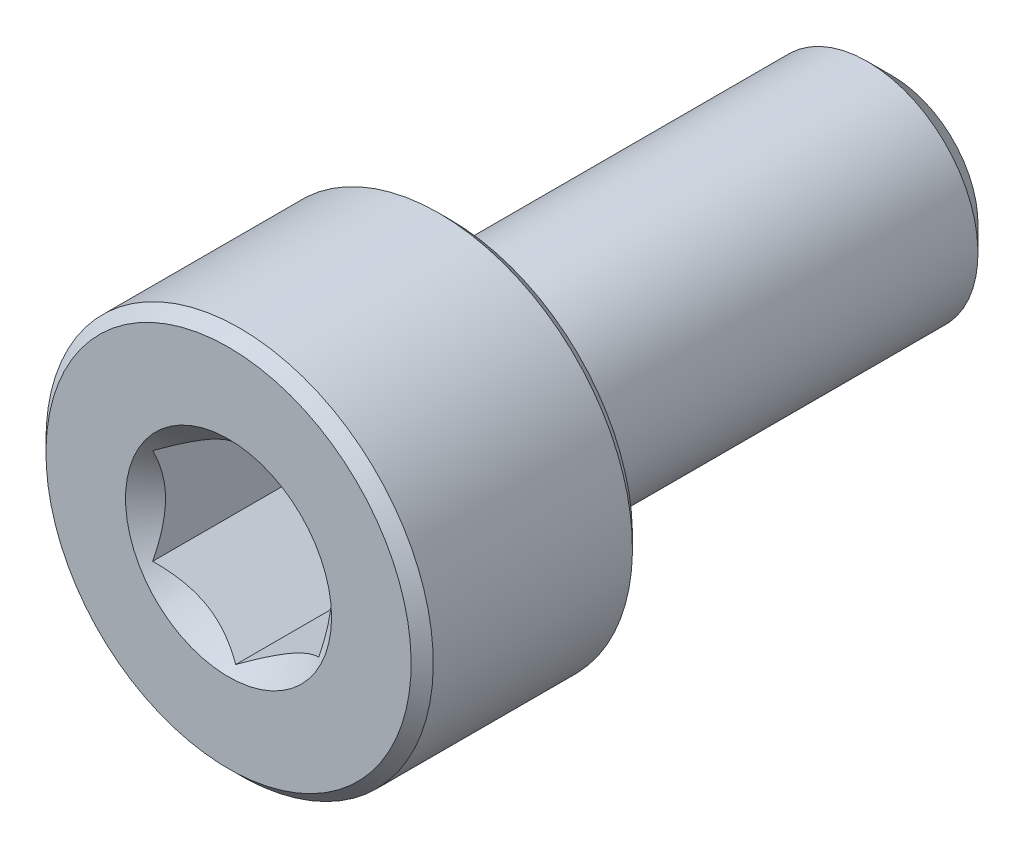
ISO-10303-21;
HEADER;
FILE_DESCRIPTION(('STEP AP214'),'2;1');
FILE_NAME('part.step','',(''),(''),'','','');
FILE_SCHEMA(('AUTOMOTIVE_DESIGN { 1 0 10303 214 1 1 1 1 }'));
ENDSEC;
DATA;
#1=APPLICATION_CONTEXT('core data for automotive mechanical design processes');
#2=APPLICATION_PROTOCOL_DEFINITION('international standard','automotive_design',2000,#1);
#3=PRODUCT_CONTEXT('',#1,'mechanical');
#4=PRODUCT('Part','Part','',(#3));
#5=PRODUCT_RELATED_PRODUCT_CATEGORY('part','',(#4));
#6=PRODUCT_DEFINITION_FORMATION('','',#4);
#7=PRODUCT_DEFINITION_CONTEXT('part definition',#1,'design');
#8=PRODUCT_DEFINITION('design','',#6,#7);
#9=PRODUCT_DEFINITION_SHAPE('','',#8);
#10=(LENGTH_UNIT() NAMED_UNIT(*) SI_UNIT(.MILLI.,.METRE.));
#11=(NAMED_UNIT(*) PLANE_ANGLE_UNIT() SI_UNIT($,.RADIAN.));
#12=(NAMED_UNIT(*) SI_UNIT($,.STERADIAN.) SOLID_ANGLE_UNIT());
#13=UNCERTAINTY_MEASURE_WITH_UNIT(LENGTH_MEASURE(1.E-05),#10,'distance_accuracy_value','');
#14=(GEOMETRIC_REPRESENTATION_CONTEXT(3) GLOBAL_UNCERTAINTY_ASSIGNED_CONTEXT((#13)) GLOBAL_UNIT_ASSIGNED_CONTEXT((#10,
#11,#12)) REPRESENTATION_CONTEXT('',''));
#15=CARTESIAN_POINT('',(0.,0.,0.));
#16=DIRECTION('',(0.,0.,1.));
#17=DIRECTION('',(1.,0.,0.));
#18=AXIS2_PLACEMENT_3D('',#15,#16,#17);
#19=CARTESIAN_POINT('',(0.,1.54533666301317,-6.));
#20=DIRECTION('',(0.,0.,-1.));
#21=DIRECTION('',(0.,1.,0.));
#22=AXIS2_PLACEMENT_3D('',#19,#20,#21);
#23=PLANE('',#22);
#24=CARTESIAN_POINT('',(0.,0.,-6.));
#25=DIRECTION('',(0.,0.,-1.));
#26=DIRECTION('',(0.,1.,0.));
#27=AXIS2_PLACEMENT_3D('',#24,#25,#26);
#28=CIRCLE('',#27,1.54533666301317);
#29=CARTESIAN_POINT('',(0.,1.54533666301317,-6.));
#30=VERTEX_POINT('',#29);
#31=EDGE_CURVE('E49',#30,#30,#28,.T.);
#32=ORIENTED_EDGE('',*,*,#31,.T.);
#33=EDGE_LOOP('',(#32));
#34=FACE_BOUND('',#33,.T.);
#35=ADVANCED_FACE('F36',(#34),#23,.T.);
#36=CARTESIAN_POINT('',(0.,0.,-6.));
#37=DIRECTION('',(0.,0.,1.));
#38=DIRECTION('',(0.,-1.,0.));
#39=AXIS2_PLACEMENT_3D('',#36,#37,#38);
#40=CONICAL_SURFACE('',#39,1.54533666301317,0.785398163397445);
#41=CARTESIAN_POINT('',(0.,0.,-5.54533666301317));
#42=DIRECTION('',(0.,0.,-1.));
#43=DIRECTION('',(0.,1.,0.));
#44=AXIS2_PLACEMENT_3D('',#41,#42,#43);
#45=CIRCLE('',#44,2.);
#46=CARTESIAN_POINT('',(0.,2.,-5.54533666301317));
#47=VERTEX_POINT('',#46);
#48=EDGE_CURVE('E152',#47,#47,#45,.T.);
#49=ORIENTED_EDGE('',*,*,#48,.T.);
#50=EDGE_LOOP('',(#49));
#51=FACE_BOUND('',#50,.T.);
#52=ORIENTED_EDGE('',*,*,#31,.F.);
#53=EDGE_LOOP('',(#52));
#54=FACE_BOUND('',#53,.T.);
#55=ADVANCED_FACE('F158',(#51,#54),#40,.T.);
#56=CARTESIAN_POINT('',(0.,0.,-6.));
#57=DIRECTION('',(0.,0.,-1.));
#58=DIRECTION('',(0.,1.,0.));
#59=AXIS2_PLACEMENT_3D('',#56,#57,#58);
#60=CYLINDRICAL_SURFACE('',#59,2.);
#61=CARTESIAN_POINT('',(0.,0.,1.8));
#62=DIRECTION('',(0.,0.,-1.));
#63=DIRECTION('',(0.,1.,0.));
#64=AXIS2_PLACEMENT_3D('',#61,#62,#63);
#65=CIRCLE('',#64,2.);
#66=CARTESIAN_POINT('',(0.,2.,1.8));
#67=VERTEX_POINT('',#66);
#68=EDGE_CURVE('E149',#67,#67,#65,.T.);
#69=ORIENTED_EDGE('',*,*,#68,.T.);
#70=EDGE_LOOP('',(#69));
#71=FACE_BOUND('',#70,.T.);
#72=ORIENTED_EDGE('',*,*,#48,.F.);
#73=EDGE_LOOP('',(#72));
#74=FACE_BOUND('',#73,.T.);
#75=ADVANCED_FACE('F160',(#71,#74),#60,.T.);
#76=CARTESIAN_POINT('',(0.,0.,1.8));
#77=DIRECTION('',(0.,0.,-1.));
#78=DIRECTION('',(0.,1.,0.));
#79=AXIS2_PLACEMENT_3D('',#76,#77,#78);
#80=TOROIDAL_SURFACE('',#79,2.2,0.200000000000001);
#81=CARTESIAN_POINT('',(0.,0.,2.));
#82=DIRECTION('',(0.,0.,-1.));
#83=DIRECTION('',(0.,1.,0.));
#84=AXIS2_PLACEMENT_3D('',#81,#82,#83);
#85=CIRCLE('',#84,2.2);
#86=CARTESIAN_POINT('',(0.,2.2,2.));
#87=VERTEX_POINT('',#86);
#88=EDGE_CURVE('E146',#87,#87,#85,.T.);
#89=ORIENTED_EDGE('',*,*,#88,.T.);
#90=EDGE_LOOP('',(#89));
#91=FACE_BOUND('',#90,.T.);
#92=ORIENTED_EDGE('',*,*,#68,.F.);
#93=EDGE_LOOP('',(#92));
#94=FACE_BOUND('',#93,.T.);
#95=ADVANCED_FACE('F166',(#91,#94),#80,.F.);
#96=CARTESIAN_POINT('',(0.,3.3,2.));
#97=DIRECTION('',(0.,0.,-1.));
#98=DIRECTION('',(0.,1.,0.));
#99=AXIS2_PLACEMENT_3D('',#96,#97,#98);
#100=PLANE('',#99);
#101=CARTESIAN_POINT('',(0.,0.,2.));
#102=DIRECTION('',(0.,0.,-1.));
#103=DIRECTION('',(0.,1.,0.));
#104=AXIS2_PLACEMENT_3D('',#101,#102,#103);
#105=CIRCLE('',#104,3.3);
#106=CARTESIAN_POINT('',(0.,3.3,2.));
#107=VERTEX_POINT('',#106);
#108=EDGE_CURVE('E143',#107,#107,#105,.T.);
#109=ORIENTED_EDGE('',*,*,#108,.T.);
#110=EDGE_LOOP('',(#109));
#111=FACE_BOUND('',#110,.T.);
#112=ORIENTED_EDGE('',*,*,#88,.F.);
#113=EDGE_LOOP('',(#112));
#114=FACE_BOUND('',#113,.T.);
#115=ADVANCED_FACE('F172',(#111,#114),#100,.T.);
#116=CARTESIAN_POINT('',(0.,0.,2.));
#117=DIRECTION('',(0.,0.,1.));
#118=DIRECTION('',(0.,-1.,0.));
#119=AXIS2_PLACEMENT_3D('',#116,#117,#118);
#120=CONICAL_SURFACE('',#119,3.3,0.785398163397447);
#121=CARTESIAN_POINT('',(0.,0.,2.2));
#122=DIRECTION('',(0.,0.,-1.));
#123=DIRECTION('',(0.,1.,0.));
#124=AXIS2_PLACEMENT_3D('',#121,#122,#123);
#125=CIRCLE('',#124,3.5);
#126=CARTESIAN_POINT('',(0.,3.5,2.2));
#127=VERTEX_POINT('',#126);
#128=EDGE_CURVE('E140',#127,#127,#125,.T.);
#129=ORIENTED_EDGE('',*,*,#128,.T.);
#130=EDGE_LOOP('',(#129));
#131=FACE_BOUND('',#130,.T.);
#132=ORIENTED_EDGE('',*,*,#108,.F.);
#133=EDGE_LOOP('',(#132));
#134=FACE_BOUND('',#133,.T.);
#135=ADVANCED_FACE('F176',(#131,#134),#120,.T.);
#136=CARTESIAN_POINT('',(0.,0.,-6.));
#137=DIRECTION('',(0.,0.,-1.));
#138=DIRECTION('',(0.,1.,0.));
#139=AXIS2_PLACEMENT_3D('',#136,#137,#138);
#140=CYLINDRICAL_SURFACE('',#139,3.5);
#141=CARTESIAN_POINT('',(0.,0.,5.8));
#142=DIRECTION('',(0.,0.,-1.));
#143=DIRECTION('',(0.,1.,0.));
#144=AXIS2_PLACEMENT_3D('',#141,#142,#143);
#145=CIRCLE('',#144,3.5);
#146=CARTESIAN_POINT('',(0.,3.5,5.8));
#147=VERTEX_POINT('',#146);
#148=EDGE_CURVE('E137',#147,#147,#145,.T.);
#149=ORIENTED_EDGE('',*,*,#148,.T.);
#150=EDGE_LOOP('',(#149));
#151=FACE_BOUND('',#150,.T.);
#152=ORIENTED_EDGE('',*,*,#128,.F.);
#153=EDGE_LOOP('',(#152));
#154=FACE_BOUND('',#153,.T.);
#155=ADVANCED_FACE('F180',(#151,#154),#140,.T.);
#156=CARTESIAN_POINT('',(0.,0.,5.8));
#157=DIRECTION('',(0.,0.,-1.));
#158=DIRECTION('',(0.,1.,0.));
#159=AXIS2_PLACEMENT_3D('',#156,#157,#158);
#160=CONICAL_SURFACE('',#159,3.5,0.785398163397452);
#161=CARTESIAN_POINT('',(0.,0.,6.));
#162=DIRECTION('',(0.,0.,-1.));
#163=DIRECTION('',(0.,1.,0.));
#164=AXIS2_PLACEMENT_3D('',#161,#162,#163);
#165=CIRCLE('',#164,3.3);
#166=CARTESIAN_POINT('',(0.,3.3,6.));
#167=VERTEX_POINT('',#166);
#168=EDGE_CURVE('E134',#167,#167,#165,.T.);
#169=ORIENTED_EDGE('',*,*,#168,.T.);
#170=EDGE_LOOP('',(#169));
#171=FACE_BOUND('',#170,.T.);
#172=ORIENTED_EDGE('',*,*,#148,.F.);
#173=EDGE_LOOP('',(#172));
#174=FACE_BOUND('',#173,.T.);
#175=ADVANCED_FACE('F184',(#171,#174),#160,.T.);
#176=CARTESIAN_POINT('',(0.,0.,6.));
#177=DIRECTION('',(0.,0.,1.));
#178=DIRECTION('',(0.,-1.,0.));
#179=AXIS2_PLACEMENT_3D('',#176,#177,#178);
#180=PLANE('',#179);
#181=CARTESIAN_POINT('',(0.,0.,6.));
#182=DIRECTION('',(0.,0.,1.));
#183=DIRECTION('',(1.,0.,0.));
#184=AXIS2_PLACEMENT_3D('',#181,#182,#183);
#185=CIRCLE('',#184,1.86195461813654);
#186=CARTESIAN_POINT('',(1.86195461813654,0.,6.));
#187=VERTEX_POINT('',#186);
#188=EDGE_CURVE('E108',#187,#187,#185,.T.);
#189=ORIENTED_EDGE('',*,*,#188,.F.);
#190=EDGE_LOOP('',(#189));
#191=FACE_BOUND('',#190,.T.);
#192=ORIENTED_EDGE('',*,*,#168,.F.);
#193=EDGE_LOOP('',(#192));
#194=FACE_BOUND('',#193,.T.);
#195=ADVANCED_FACE('F188',(#191,#194),#180,.T.);
#196=CARTESIAN_POINT('',(0.,0.,6.));
#197=DIRECTION('',(0.,0.,1.));
#198=DIRECTION('',(1.,0.,0.));
#199=AXIS2_PLACEMENT_3D('',#196,#197,#198);
#200=CONICAL_SURFACE('',#199,1.86195461813654,0.78539816339745);
#201=ORIENTED_EDGE('',*,*,#188,.T.);
#202=EDGE_LOOP('',(#201));
#203=FACE_BOUND('',#202,.T.);
#204=CARTESIAN_POINT('',(-0.00019999999999937,-1.73216627762272,5.87021167103241));
#205=CARTESIAN_POINT('',(0.051367790737076,-1.70239359975915,5.84046166549966));
#206=CARTESIAN_POINT('',(0.103797917665201,-1.67212305186355,5.81245867334265));
#207=CARTESIAN_POINT('',(0.210709034055597,-1.61039789003619,5.76118541987248));
#208=CARTESIAN_POINT('',(0.265200195814661,-1.57893740312614,5.73794369447671));
#209=CARTESIAN_POINT('',(0.375079081357249,-1.51549879897987,5.69812991842456));
#210=CARTESIAN_POINT('',(0.4304388090952,-1.4835368452681,5.68145777510323));
#211=CARTESIAN_POINT('',(0.542377257477151,-1.41890915196211,5.65577064625044));
#212=CARTESIAN_POINT('',(0.598952556553009,-1.38624538781118,5.6467364799112));
#213=CARTESIAN_POINT('',(0.696455389516441,-1.32995210095299,5.63858527065919));
#214=CARTESIAN_POINT('',(0.737256908280467,-1.30639533311124,5.63737844242155));
#215=CARTESIAN_POINT('',(0.818787969615859,-1.25932335290193,5.6394102465946));
#216=CARTESIAN_POINT('',(0.85951749431463,-1.23580815085313,5.64264986018064));
#217=CARTESIAN_POINT('',(0.940584402163416,-1.18900414978427,5.6533881754143));
#218=CARTESIAN_POINT('',(0.980921384598289,-1.16571558211719,5.66089084245107));
#219=CARTESIAN_POINT('',(1.06091833691403,-1.11952932016335,5.67974780136062));
#220=CARTESIAN_POINT('',(1.10057800851621,-1.09663179808786,5.69110374645092));
#221=CARTESIAN_POINT('',(1.20216313477449,-1.03798159809698,5.72481783702501));
#222=CARTESIAN_POINT('',(1.26345855370969,-1.00259267147465,5.7497180385257));
#223=CARTESIAN_POINT('',(1.35358562846331,-0.950557780604374,5.79175284270391));
#224=CARTESIAN_POINT('',(1.38328513990772,-0.933410759677147,5.80652134299143));
#225=CARTESIAN_POINT('',(1.44213790138375,-0.899432101996406,5.8374067553725));
#226=CARTESIAN_POINT('',(1.47129140422064,-0.88260031928571,5.85352302355404));
#227=CARTESIAN_POINT('',(1.5002,-0.8659099337306,5.87021167103241));
#228=B_SPLINE_CURVE_WITH_KNOTS('',3,(#204,#205,#206,#207,#208,#209,#210,#211,#212,#213,#214,
#215,#216,#217,#218,#219,#220,#221,#222,#223,#224,#225,#226,#227),.UNSPECIFIED.,.F.,.F.,(4,2,2,
2,2,2,2,2,2,2,2,4),(0.,0.199829143693304,0.400822987382388,0.598623720538181,0.795926240188889,
0.937113067959881,1.07833105577193,1.21968061668222,1.36109089931054,1.58570969637565,
1.69770705470964,1.80965120737194),.UNSPECIFIED.);
#229=CARTESIAN_POINT('',(0.,-1.73205080756888,5.87009618943233));
#230=VERTEX_POINT('',#229);
#231=CARTESIAN_POINT('',(1.5,-0.866025403784438,5.87009618943233));
#232=VERTEX_POINT('',#231);
#233=EDGE_CURVE('E12',#230,#232,#228,.T.);
#234=ORIENTED_EDGE('',*,*,#233,.F.);
#235=CARTESIAN_POINT('',(-1.5002,-0.865909933730601,5.87021167103241));
#236=CARTESIAN_POINT('',(-1.44863220926292,-0.895682611594166,5.84046166549966));
#237=CARTESIAN_POINT('',(-1.3962020823348,-0.925953159489765,5.81245867334265));
#238=CARTESIAN_POINT('',(-1.2892909659444,-0.987678321317123,5.76118541987248));
#239=CARTESIAN_POINT('',(-1.23479980418534,-1.01913880822717,5.73794369447671));
#240=CARTESIAN_POINT('',(-1.12492091864275,-1.08257741237344,5.69812991842455));
#241=CARTESIAN_POINT('',(-1.0695611909048,-1.11453936608521,5.68145777510323));
#242=CARTESIAN_POINT('',(-0.957622742522849,-1.1791670593912,5.65577064625044));
#243=CARTESIAN_POINT('',(-0.901047443446991,-1.21183082354213,5.6467364799112));
#244=CARTESIAN_POINT('',(-0.803544610483559,-1.26812411040032,5.63858527065919));
#245=CARTESIAN_POINT('',(-0.762743091719533,-1.29168087824208,5.63737844242155));
#246=CARTESIAN_POINT('',(-0.681212030384141,-1.33875285845138,5.6394102465946));
#247=CARTESIAN_POINT('',(-0.64048250568537,-1.36226806050018,5.64264986018064));
#248=CARTESIAN_POINT('',(-0.559415597836584,-1.40907206156905,5.6533881754143));
#249=CARTESIAN_POINT('',(-0.519078615401712,-1.43236062923612,5.66089084245107));
#250=CARTESIAN_POINT('',(-0.439081663085969,-1.47854689118996,5.67974780136062));
#251=CARTESIAN_POINT('',(-0.399421991483792,-1.50144441326545,5.69110374645092));
#252=CARTESIAN_POINT('',(-0.297836865225515,-1.56009461325633,5.72481783702501));
#253=CARTESIAN_POINT('',(-0.236541446290311,-1.59548353987866,5.7497180385257));
#254=CARTESIAN_POINT('',(-0.146414371536686,-1.64751843074894,5.79175284270391));
#255=CARTESIAN_POINT('',(-0.116714860092282,-1.66466545167617,5.80652134299143));
#256=CARTESIAN_POINT('',(-0.057862098616249,-1.69864410935691,5.8374067553725));
#257=CARTESIAN_POINT('',(-0.0287085957793625,-1.71547589206761,5.85352302355404));
#258=CARTESIAN_POINT('',(0.000200000000000615,-1.73216627762272,5.87021167103241));
#259=B_SPLINE_CURVE_WITH_KNOTS('',3,(#235,#236,#237,#238,#239,#240,#241,#242,#243,#244,#245,
#246,#247,#248,#249,#250,#251,#252,#253,#254,#255,#256,#257,#258),.UNSPECIFIED.,.F.,.F.,(4,2,2,
2,2,2,2,2,2,2,2,4),(0.,0.199829143693305,0.400822987382388,0.59862372053818,0.795926240188889,
0.937113067959881,1.07833105577193,1.21968061668222,1.36109089931054,1.58570969637565,
1.69770705470964,1.80965120737194),.UNSPECIFIED.);
#260=CARTESIAN_POINT('',(-1.5,-0.866025403784439,5.87009618943233));
#261=VERTEX_POINT('',#260);
#262=EDGE_CURVE('E94',#261,#230,#259,.T.);
#263=ORIENTED_EDGE('',*,*,#262,.F.);
#264=CARTESIAN_POINT('',(-1.5,-1.81798631684901,6.49496588290931));
#265=CARTESIAN_POINT('',(-1.5,-1.77410479833239,6.46112335419702));
#266=CARTESIAN_POINT('',(-1.5,-1.72998897047494,6.42758561768896));
#267=CARTESIAN_POINT('',(-1.5,-1.64119029432319,6.36124817349269));
#268=CARTESIAN_POINT('',(-1.5,-1.59650731534755,6.328448640911));
#269=CARTESIAN_POINT('',(-1.5,-1.460806940489,6.23088193148043));
#270=CARTESIAN_POINT('',(-1.5,-1.36880251235632,6.1674654206559));
#271=CARTESIAN_POINT('',(-1.5,-1.17526237686872,6.04210237172158));
#272=CARTESIAN_POINT('',(-1.5,-1.07349393006072,5.98051141536721));
#273=CARTESIAN_POINT('',(-1.5,-0.864764842560628,5.86725220599653));
#274=CARTESIAN_POINT('',(-1.5,-0.757823334449949,5.81555043950584));
#275=CARTESIAN_POINT('',(-1.5,-0.598146069886858,5.75227317361643));
#276=CARTESIAN_POINT('',(-1.5,-0.547969945491557,5.73427408399123));
#277=CARTESIAN_POINT('',(-1.5,-0.446326869364775,5.70229546522083));
#278=CARTESIAN_POINT('',(-1.5,-0.394859836419925,5.68831618966241));
#279=CARTESIAN_POINT('',(-1.5,-0.291848397493325,5.66536569037263));
#280=CARTESIAN_POINT('',(-1.5,-0.240324749628771,5.65630281543282));
#281=CARTESIAN_POINT('',(-1.5,-0.13662544851591,5.64337711521516));
#282=CARTESIAN_POINT('',(-1.5,-0.0844499362377801,5.6395131846234));
#283=CARTESIAN_POINT('',(-1.5,0.0176806967011131,5.63731961256892));
#284=CARTESIAN_POINT('',(-1.5,0.0676307045116617,5.63875006923659));
#285=CARTESIAN_POINT('',(-1.5,0.16714547763776,5.64651331423855));
#286=CARTESIAN_POINT('',(-1.5,0.216710207908513,5.6528465433779));
#287=CARTESIAN_POINT('',(-1.5,0.315937150651982,5.67016271707146));
#288=CARTESIAN_POINT('',(-1.5,0.365584733694539,5.68122815181031));
#289=CARTESIAN_POINT('',(-1.5,0.46378160619877,5.70739349919908));
#290=CARTESIAN_POINT('',(-1.5,0.512330953840259,5.72249319758548));
#291=CARTESIAN_POINT('',(-1.5,0.66131302328769,5.77461385569168));
#292=CARTESIAN_POINT('',(-1.5,0.759720789706277,5.81740496304236));
#293=CARTESIAN_POINT('',(-1.5,0.95194266902277,5.91263883721007));
#294=CARTESIAN_POINT('',(-1.5,1.04573912191844,5.96511552648595));
#295=CARTESIAN_POINT('',(-1.5,1.22504153577549,6.0734783373155));
#296=CARTESIAN_POINT('',(-1.5,1.3107282773288,6.12906910554414));
#297=CARTESIAN_POINT('',(-1.5,1.43696960041027,6.21505045621636));
#298=CARTESIAN_POINT('',(-1.5,1.47850725450332,6.24402268297088));
#299=CARTESIAN_POINT('',(-1.5,1.56101250374723,6.30274488393776));
#300=CARTESIAN_POINT('',(-1.5,1.60198025290925,6.33249464151831));
#301=CARTESIAN_POINT('',(-1.5,1.64271029717086,6.36256715528604));
#302=B_SPLINE_CURVE_WITH_KNOTS('',3,(#264,#265,#266,#267,#268,#269,#270,#271,#272,#273,#274,
#275,#276,#277,#278,#279,#280,#281,#282,#283,#284,#285,#286,#287,#288,#289,#290,#291,#292,#293,
#294,#295,#296,#297,#298,#299,#300,#301),.UNSPECIFIED.,.F.,.F.,(4,2,2,2,2,2,2,2,2,2,2,2,2,2,2,2,
2,2,4),(0.,0.166243250325254,0.332525527595494,0.667617582874064,1.02421660314856,
1.37958485991002,1.53937185590113,1.69916892971772,1.85587466130012,2.01254707142443,
2.16220898927398,2.31188436469119,2.46428258498153,2.61667271286895,2.93766301623296,
3.25979964661299,3.56606529199603,3.71798989158865,3.86987260467919),.UNSPECIFIED.);
#303=CARTESIAN_POINT('',(-1.5,0.866025403784438,5.87009618943233));
#304=VERTEX_POINT('',#303);
#305=EDGE_CURVE('E107',#304,#261,#302,.F.);
#306=ORIENTED_EDGE('',*,*,#305,.F.);
#307=CARTESIAN_POINT('',(0.000199999999999571,1.73216627762272,5.87021167103241));
#308=CARTESIAN_POINT('',(-0.0513677907370762,1.70239359975915,5.84046166549966));
#309=CARTESIAN_POINT('',(-0.103797917665201,1.67212305186355,5.81245867334265));
#310=CARTESIAN_POINT('',(-0.210709034055597,1.61039789003619,5.76118541987248));
#311=CARTESIAN_POINT('',(-0.265200195814662,1.57893740312614,5.73794369447671));
#312=CARTESIAN_POINT('',(-0.375079081357249,1.51549879897987,5.69812991842455));
#313=CARTESIAN_POINT('',(-0.4304388090952,1.4835368452681,5.68145777510323));
#314=CARTESIAN_POINT('',(-0.542377257477151,1.41890915196211,5.65577064625044));
#315=CARTESIAN_POINT('',(-0.598952556553009,1.38624538781118,5.6467364799112));
#316=CARTESIAN_POINT('',(-0.696455389516441,1.32995210095299,5.63858527065919));
#317=CARTESIAN_POINT('',(-0.737256908280466,1.30639533311124,5.63737844242155));
#318=CARTESIAN_POINT('',(-0.818787969615858,1.25932335290193,5.6394102465946));
#319=CARTESIAN_POINT('',(-0.85951749431463,1.23580815085313,5.64264986018064));
#320=CARTESIAN_POINT('',(-0.940584402163416,1.18900414978427,5.6533881754143));
#321=CARTESIAN_POINT('',(-0.980921384598288,1.16571558211719,5.66089084245107));
#322=CARTESIAN_POINT('',(-1.06091833691403,1.11952932016335,5.67974780136062));
#323=CARTESIAN_POINT('',(-1.10057800851621,1.09663179808786,5.69110374645092));
#324=CARTESIAN_POINT('',(-1.20216313477448,1.03798159809698,5.72481783702501));
#325=CARTESIAN_POINT('',(-1.26345855370969,1.00259267147465,5.7497180385257));
#326=CARTESIAN_POINT('',(-1.35358562846331,0.950557780604374,5.79175284270391));
#327=CARTESIAN_POINT('',(-1.38328513990772,0.933410759677147,5.80652134299143));
#328=CARTESIAN_POINT('',(-1.44213790138375,0.899432101996406,5.8374067553725));
#329=CARTESIAN_POINT('',(-1.47129140422064,0.882600319285709,5.85352302355404));
#330=CARTESIAN_POINT('',(-1.5002,0.8659099337306,5.87021167103241));
#331=B_SPLINE_CURVE_WITH_KNOTS('',3,(#307,#308,#309,#310,#311,#312,#313,#314,#315,#316,#317,
#318,#319,#320,#321,#322,#323,#324,#325,#326,#327,#328,#329,#330),.UNSPECIFIED.,.F.,.F.,(4,2,2,
2,2,2,2,2,2,2,2,4),(0.,0.199829143693305,0.400822987382389,0.598623720538182,0.795926240188889,
0.937113067959881,1.07833105577193,1.21968061668222,1.36109089931054,1.58570969637565,
1.69770705470964,1.80965120737194),.UNSPECIFIED.);
#332=CARTESIAN_POINT('',(0.,1.73205080756888,5.87009618943233));
#333=VERTEX_POINT('',#332);
#334=EDGE_CURVE('E238',#333,#304,#331,.T.);
#335=ORIENTED_EDGE('',*,*,#334,.F.);
#336=CARTESIAN_POINT('',(1.5002,0.865909933730601,5.87021167103241));
#337=CARTESIAN_POINT('',(1.44863220926292,0.895682611594166,5.84046166549966));
#338=CARTESIAN_POINT('',(1.3962020823348,0.925953159489765,5.81245867334265));
#339=CARTESIAN_POINT('',(1.2892909659444,0.987678321317124,5.76118541987248));
#340=CARTESIAN_POINT('',(1.23479980418534,1.01913880822717,5.73794369447671));
#341=CARTESIAN_POINT('',(1.12492091864275,1.08257741237344,5.69812991842455));
#342=CARTESIAN_POINT('',(1.0695611909048,1.11453936608521,5.68145777510323));
#343=CARTESIAN_POINT('',(0.957622742522849,1.1791670593912,5.65577064625044));
#344=CARTESIAN_POINT('',(0.901047443446991,1.21183082354213,5.6467364799112));
#345=CARTESIAN_POINT('',(0.803544610483559,1.26812411040032,5.63858527065919));
#346=CARTESIAN_POINT('',(0.762743091719534,1.29168087824208,5.63737844242155));
#347=CARTESIAN_POINT('',(0.681212030384142,1.33875285845138,5.6394102465946));
#348=CARTESIAN_POINT('',(0.64048250568537,1.36226806050018,5.64264986018064));
#349=CARTESIAN_POINT('',(0.559415597836584,1.40907206156905,5.6533881754143));
#350=CARTESIAN_POINT('',(0.519078615401712,1.43236062923612,5.66089084245107));
#351=CARTESIAN_POINT('',(0.439081663085969,1.47854689118996,5.67974780136062));
#352=CARTESIAN_POINT('',(0.399421991483792,1.50144441326545,5.69110374645092));
#353=CARTESIAN_POINT('',(0.297836865225515,1.56009461325633,5.72481783702501));
#354=CARTESIAN_POINT('',(0.236541446290311,1.59548353987866,5.7497180385257));
#355=CARTESIAN_POINT('',(0.146414371536686,1.64751843074894,5.79175284270391));
#356=CARTESIAN_POINT('',(0.116714860092282,1.66466545167617,5.80652134299143));
#357=CARTESIAN_POINT('',(0.0578620986162488,1.69864410935691,5.8374067553725));
#358=CARTESIAN_POINT('',(0.0287085957793624,1.71547589206761,5.85352302355404));
#359=CARTESIAN_POINT('',(-0.000200000000000376,1.73216627762272,5.87021167103241));
#360=B_SPLINE_CURVE_WITH_KNOTS('',3,(#336,#337,#338,#339,#340,#341,#342,#343,#344,#345,#346,
#347,#348,#349,#350,#351,#352,#353,#354,#355,#356,#357,#358,#359),.UNSPECIFIED.,.F.,.F.,(4,2,2,
2,2,2,2,2,2,2,2,4),(0.,0.199829143693305,0.400822987382389,0.598623720538181,0.795926240188889,
0.937113067959881,1.07833105577193,1.21968061668222,1.36109089931054,1.58570969637565,
1.69770705470964,1.80965120737194),.UNSPECIFIED.);
#361=CARTESIAN_POINT('',(1.5,0.866025403784439,5.87009618943233));
#362=VERTEX_POINT('',#361);
#363=EDGE_CURVE('E211',#362,#333,#360,.T.);
#364=ORIENTED_EDGE('',*,*,#363,.F.);
#365=CARTESIAN_POINT('',(1.5,-1.81798631684901,6.49496588290931));
#366=CARTESIAN_POINT('',(1.5,-1.77410479833239,6.46112335419702));
#367=CARTESIAN_POINT('',(1.5,-1.72998897047494,6.42758561768896));
#368=CARTESIAN_POINT('',(1.5,-1.64119029432319,6.36124817349268));
#369=CARTESIAN_POINT('',(1.5,-1.59650731534755,6.328448640911));
#370=CARTESIAN_POINT('',(1.5,-1.460806940489,6.23088193148043));
#371=CARTESIAN_POINT('',(1.5,-1.36880251235632,6.1674654206559));
#372=CARTESIAN_POINT('',(1.5,-1.17526237686872,6.04210237172158));
#373=CARTESIAN_POINT('',(1.5,-1.07349393006072,5.98051141536721));
#374=CARTESIAN_POINT('',(1.5,-0.864764842560628,5.86725220599653));
#375=CARTESIAN_POINT('',(1.5,-0.757823334449949,5.81555043950584));
#376=CARTESIAN_POINT('',(1.5,-0.598146069886858,5.75227317361643));
#377=CARTESIAN_POINT('',(1.5,-0.547969945491557,5.73427408399124));
#378=CARTESIAN_POINT('',(1.5,-0.446326869364774,5.70229546522083));
#379=CARTESIAN_POINT('',(1.5,-0.394859836419925,5.68831618966241));
#380=CARTESIAN_POINT('',(1.5,-0.291848397493325,5.66536569037263));
#381=CARTESIAN_POINT('',(1.5,-0.240324749628771,5.65630281543282));
#382=CARTESIAN_POINT('',(1.5,-0.13662544851591,5.64337711521516));
#383=CARTESIAN_POINT('',(1.5,-0.0844499362377801,5.6395131846234));
#384=CARTESIAN_POINT('',(1.5,0.017680696701113,5.63731961256892));
#385=CARTESIAN_POINT('',(1.5,0.0676307045116617,5.63875006923659));
#386=CARTESIAN_POINT('',(1.5,0.16714547763776,5.64651331423855));
#387=CARTESIAN_POINT('',(1.5,0.216710207908513,5.6528465433779));
#388=CARTESIAN_POINT('',(1.5,0.315937150651982,5.67016271707146));
#389=CARTESIAN_POINT('',(1.5,0.365584733694538,5.68122815181031));
#390=CARTESIAN_POINT('',(1.5,0.463781606198769,5.70739349919908));
#391=CARTESIAN_POINT('',(1.5,0.512330953840258,5.72249319758548));
#392=CARTESIAN_POINT('',(1.5,0.661313023287689,5.77461385569168));
#393=CARTESIAN_POINT('',(1.5,0.759720789706276,5.81740496304236));
#394=CARTESIAN_POINT('',(1.5,0.951942669022769,5.91263883721007));
#395=CARTESIAN_POINT('',(1.5,1.04573912191844,5.96511552648595));
#396=CARTESIAN_POINT('',(1.5,1.22504153577548,6.0734783373155));
#397=CARTESIAN_POINT('',(1.5,1.3107282773288,6.12906910554413));
#398=CARTESIAN_POINT('',(1.5,1.43696960041027,6.21505045621636));
#399=CARTESIAN_POINT('',(1.5,1.47850725450332,6.24402268297088));
#400=CARTESIAN_POINT('',(1.5,1.56101250374723,6.30274488393776));
#401=CARTESIAN_POINT('',(1.5,1.60198025290925,6.3324946415183));
#402=CARTESIAN_POINT('',(1.5,1.64271029717086,6.36256715528604));
#403=B_SPLINE_CURVE_WITH_KNOTS('',3,(#365,#366,#367,#368,#369,#370,#371,#372,#373,#374,#375,
#376,#377,#378,#379,#380,#381,#382,#383,#384,#385,#386,#387,#388,#389,#390,#391,#392,#393,#394,
#395,#396,#397,#398,#399,#400,#401,#402),.UNSPECIFIED.,.F.,.F.,(4,2,2,2,2,2,2,2,2,2,2,2,2,2,2,2,
2,2,4),(0.,0.166243250325254,0.332525527595493,0.667617582874062,1.02421660314856,
1.37958485991001,1.53937185590113,1.69916892971772,1.85587466130012,2.01254707142443,
2.16220898927398,2.31188436469119,2.46428258498153,2.61667271286894,2.93766301623296,
3.25979964661299,3.56606529199602,3.71798989158864,3.86987260467919),.UNSPECIFIED.);
#404=EDGE_CURVE('E56',#232,#362,#403,.T.);
#405=ORIENTED_EDGE('',*,*,#404,.F.);
#406=EDGE_LOOP('',(#234,#263,#306,#335,#364,#405));
#407=FACE_BOUND('',#406,.T.);
#408=ADVANCED_FACE('F93',(#203,#407),#200,.F.);
#409=CARTESIAN_POINT('',(0.,3.3,3.));
#410=DIRECTION('',(0.,0.,-1.));
#411=DIRECTION('',(0.,1.,0.));
#412=AXIS2_PLACEMENT_3D('',#409,#410,#411);
#413=PLANE('',#412);
#414=DIRECTION('',(0.866025403784438,0.5,0.));
#415=VECTOR('',#414,1.);
#416=CARTESIAN_POINT('',(0.,-1.73205080756888,3.));
#417=LINE('',#416,#415);
#418=CARTESIAN_POINT('',(0.,-1.73205080756888,3.));
#419=VERTEX_POINT('',#418);
#420=CARTESIAN_POINT('',(1.5,-0.866025403784438,3.));
#421=VERTEX_POINT('',#420);
#422=EDGE_CURVE('E111',#419,#421,#417,.T.);
#423=ORIENTED_EDGE('',*,*,#422,.T.);
#424=DIRECTION('',(0.,1.,0.));
#425=VECTOR('',#424,1.);
#426=CARTESIAN_POINT('',(1.5,-0.866025403784438,3.));
#427=LINE('',#426,#425);
#428=CARTESIAN_POINT('',(1.5,0.866025403784439,3.));
#429=VERTEX_POINT('',#428);
#430=EDGE_CURVE('E63',#421,#429,#427,.T.);
#431=ORIENTED_EDGE('',*,*,#430,.T.);
#432=DIRECTION('',(-0.866025403784439,0.5,0.));
#433=VECTOR('',#432,1.);
#434=CARTESIAN_POINT('',(1.5,0.866025403784439,3.));
#435=LINE('',#434,#433);
#436=CARTESIAN_POINT('',(0.,1.73205080756888,3.));
#437=VERTEX_POINT('',#436);
#438=EDGE_CURVE('E119',#429,#437,#435,.T.);
#439=ORIENTED_EDGE('',*,*,#438,.T.);
#440=DIRECTION('',(-0.866025403784438,-0.5,0.));
#441=VECTOR('',#440,1.);
#442=CARTESIAN_POINT('',(0.,1.73205080756888,3.));
#443=LINE('',#442,#441);
#444=CARTESIAN_POINT('',(-1.5,0.866025403784438,3.));
#445=VERTEX_POINT('',#444);
#446=EDGE_CURVE('E126',#437,#445,#443,.T.);
#447=ORIENTED_EDGE('',*,*,#446,.T.);
#448=DIRECTION('',(0.,-1.,0.));
#449=VECTOR('',#448,1.);
#450=CARTESIAN_POINT('',(-1.5,0.866025403784438,3.));
#451=LINE('',#450,#449);
#452=CARTESIAN_POINT('',(-1.5,-0.866025403784439,3.));
#453=VERTEX_POINT('',#452);
#454=EDGE_CURVE('E122',#445,#453,#451,.T.);
#455=ORIENTED_EDGE('',*,*,#454,.T.);
#456=DIRECTION('',(0.866025403784439,-0.5,0.));
#457=VECTOR('',#456,1.);
#458=CARTESIAN_POINT('',(-1.5,-0.866025403784439,3.));
#459=LINE('',#458,#457);
#460=EDGE_CURVE('E112',#453,#419,#459,.T.);
#461=ORIENTED_EDGE('',*,*,#460,.T.);
#462=EDGE_LOOP('',(#423,#431,#439,#447,#455,#461));
#463=FACE_BOUND('',#462,.T.);
#464=ADVANCED_FACE('F193',(#463),#413,.F.);
#465=CARTESIAN_POINT('',(0.,-1.73205080756888,-2.58257569495584));
#466=DIRECTION('',(0.5,-0.866025403784438,0.));
#467=DIRECTION('',(0.866025403784438,0.5,0.));
#468=AXIS2_PLACEMENT_3D('',#465,#466,#467);
#469=PLANE('',#468);
#470=DIRECTION('',(0.,0.,1.));
#471=VECTOR('',#470,1.);
#472=CARTESIAN_POINT('',(0.,-1.73205080756888,-2.58257569495584));
#473=LINE('',#472,#471);
#474=EDGE_CURVE('E103',#419,#230,#473,.T.);
#475=ORIENTED_EDGE('',*,*,#474,.T.);
#476=ORIENTED_EDGE('',*,*,#233,.T.);
#477=DIRECTION('',(0.,0.,1.));
#478=VECTOR('',#477,1.);
#479=CARTESIAN_POINT('',(1.5,-0.866025403784438,-2.58257569495584));
#480=LINE('',#479,#478);
#481=EDGE_CURVE('E114',#421,#232,#480,.T.);
#482=ORIENTED_EDGE('',*,*,#481,.F.);
#483=ORIENTED_EDGE('',*,*,#422,.F.);
#484=EDGE_LOOP('',(#475,#476,#482,#483));
#485=FACE_BOUND('',#484,.T.);
#486=ADVANCED_FACE('F110',(#485),#469,.F.);
#487=CARTESIAN_POINT('',(-1.5,-0.866025403784439,-2.58257569495584));
#488=DIRECTION('',(-0.5,-0.866025403784439,0.));
#489=DIRECTION('',(0.866025403784439,-0.5,0.));
#490=AXIS2_PLACEMENT_3D('',#487,#488,#489);
#491=PLANE('',#490);
#492=DIRECTION('',(0.,0.,1.));
#493=VECTOR('',#492,1.);
#494=CARTESIAN_POINT('',(-1.5,-0.866025403784439,-2.58257569495584));
#495=LINE('',#494,#493);
#496=EDGE_CURVE('E106',#453,#261,#495,.T.);
#497=ORIENTED_EDGE('',*,*,#496,.T.);
#498=ORIENTED_EDGE('',*,*,#262,.T.);
#499=ORIENTED_EDGE('',*,*,#474,.F.);
#500=ORIENTED_EDGE('',*,*,#460,.F.);
#501=EDGE_LOOP('',(#497,#498,#499,#500));
#502=FACE_BOUND('',#501,.T.);
#503=ADVANCED_FACE('F102',(#502),#491,.F.);
#504=CARTESIAN_POINT('',(-1.5,0.866025403784438,-2.58257569495584));
#505=DIRECTION('',(-1.,0.,0.));
#506=DIRECTION('',(0.,0.,1.));
#507=AXIS2_PLACEMENT_3D('',#504,#505,#506);
#508=PLANE('',#507);
#509=DIRECTION('',(0.,0.,1.));
#510=VECTOR('',#509,1.);
#511=CARTESIAN_POINT('',(-1.5,0.866025403784438,-2.58257569495584));
#512=LINE('',#511,#510);
#513=EDGE_CURVE('E123',#445,#304,#512,.T.);
#514=ORIENTED_EDGE('',*,*,#513,.T.);
#515=ORIENTED_EDGE('',*,*,#305,.T.);
#516=ORIENTED_EDGE('',*,*,#496,.F.);
#517=ORIENTED_EDGE('',*,*,#454,.F.);
#518=EDGE_LOOP('',(#514,#515,#516,#517));
#519=FACE_BOUND('',#518,.T.);
#520=ADVANCED_FACE('F247',(#519),#508,.F.);
#521=CARTESIAN_POINT('',(0.,1.73205080756888,-2.58257569495584));
#522=DIRECTION('',(-0.5,0.866025403784438,0.));
#523=DIRECTION('',(-0.866025403784438,-0.5,0.));
#524=AXIS2_PLACEMENT_3D('',#521,#522,#523);
#525=PLANE('',#524);
#526=DIRECTION('',(0.,0.,1.));
#527=VECTOR('',#526,1.);
#528=CARTESIAN_POINT('',(0.,1.73205080756888,-2.58257569495584));
#529=LINE('',#528,#527);
#530=EDGE_CURVE('E127',#437,#333,#529,.T.);
#531=ORIENTED_EDGE('',*,*,#530,.T.);
#532=ORIENTED_EDGE('',*,*,#334,.T.);
#533=ORIENTED_EDGE('',*,*,#513,.F.);
#534=ORIENTED_EDGE('',*,*,#446,.F.);
#535=EDGE_LOOP('',(#531,#532,#533,#534));
#536=FACE_BOUND('',#535,.T.);
#537=ADVANCED_FACE('F244',(#536),#525,.F.);
#538=CARTESIAN_POINT('',(1.5,0.866025403784439,-2.58257569495584));
#539=DIRECTION('',(0.5,0.866025403784439,0.));
#540=DIRECTION('',(-0.866025403784439,0.5,0.));
#541=AXIS2_PLACEMENT_3D('',#538,#539,#540);
#542=PLANE('',#541);
#543=DIRECTION('',(0.,0.,1.));
#544=VECTOR('',#543,1.);
#545=CARTESIAN_POINT('',(1.5,0.866025403784439,-2.58257569495584));
#546=LINE('',#545,#544);
#547=EDGE_CURVE('E130',#429,#362,#546,.T.);
#548=ORIENTED_EDGE('',*,*,#547,.T.);
#549=ORIENTED_EDGE('',*,*,#363,.T.);
#550=ORIENTED_EDGE('',*,*,#530,.F.);
#551=ORIENTED_EDGE('',*,*,#438,.F.);
#552=EDGE_LOOP('',(#548,#549,#550,#551));
#553=FACE_BOUND('',#552,.T.);
#554=ADVANCED_FACE('F201',(#553),#542,.F.);
#555=CARTESIAN_POINT('',(1.5,-0.866025403784438,-2.58257569495584));
#556=DIRECTION('',(1.,0.,0.));
#557=DIRECTION('',(0.,0.,-1.));
#558=AXIS2_PLACEMENT_3D('',#555,#556,#557);
#559=PLANE('',#558);
#560=ORIENTED_EDGE('',*,*,#481,.T.);
#561=ORIENTED_EDGE('',*,*,#404,.T.);
#562=ORIENTED_EDGE('',*,*,#547,.F.);
#563=ORIENTED_EDGE('',*,*,#430,.F.);
#564=EDGE_LOOP('',(#560,#561,#562,#563));
#565=FACE_BOUND('',#564,.T.);
#566=ADVANCED_FACE('F197',(#565),#559,.F.);
#567=CLOSED_SHELL('',(#35,#55,#75,#95,#115,#135,#155,#175,#195,#408,#464,#486,#503,#520,#537,
#554,#566));
#568=MANIFOLD_SOLID_BREP('B2',#567);
#569=ADVANCED_BREP_SHAPE_REPRESENTATION('',(#18,#568),#14);
#570=SHAPE_DEFINITION_REPRESENTATION(#9,#569);
ENDSEC;
END-ISO-10303-21;
